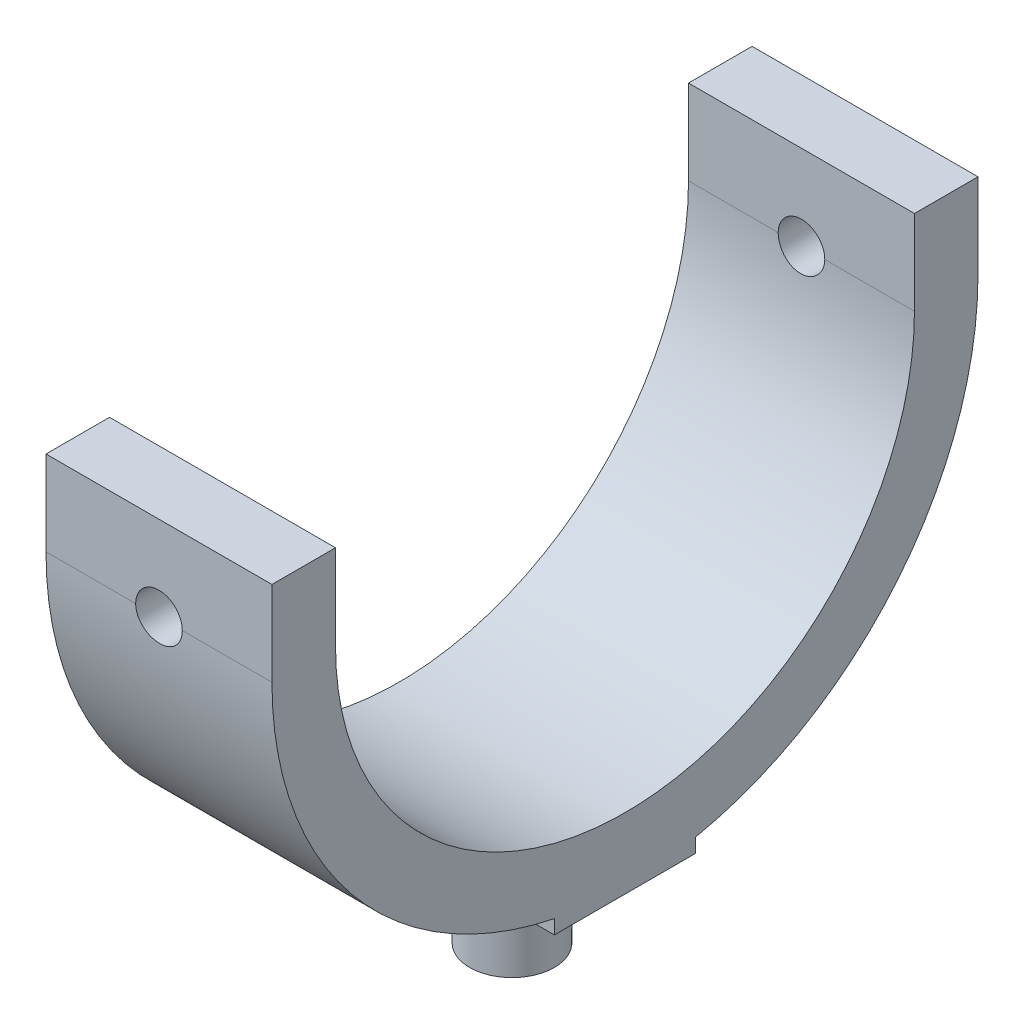
ISO-10303-21;
HEADER;
FILE_DESCRIPTION(('STEP AP214'),'2;1');
FILE_NAME('part.step','',(''),(''),'','','');
FILE_SCHEMA(('AUTOMOTIVE_DESIGN { 1 0 10303 214 1 1 1 1 }'));
ENDSEC;
DATA;
#1=APPLICATION_CONTEXT('core data for automotive mechanical design processes');
#2=APPLICATION_PROTOCOL_DEFINITION('international standard','automotive_design',2000,#1);
#3=PRODUCT_CONTEXT('',#1,'mechanical');
#4=PRODUCT('Part','Part','',(#3));
#5=PRODUCT_RELATED_PRODUCT_CATEGORY('part','',(#4));
#6=PRODUCT_DEFINITION_FORMATION('','',#4);
#7=PRODUCT_DEFINITION_CONTEXT('part definition',#1,'design');
#8=PRODUCT_DEFINITION('design','',#6,#7);
#9=PRODUCT_DEFINITION_SHAPE('','',#8);
#10=(LENGTH_UNIT() NAMED_UNIT(*) SI_UNIT(.MILLI.,.METRE.));
#11=(NAMED_UNIT(*) PLANE_ANGLE_UNIT() SI_UNIT($,.RADIAN.));
#12=(NAMED_UNIT(*) SI_UNIT($,.STERADIAN.) SOLID_ANGLE_UNIT());
#13=UNCERTAINTY_MEASURE_WITH_UNIT(LENGTH_MEASURE(1.E-05),#10,'distance_accuracy_value','');
#14=(GEOMETRIC_REPRESENTATION_CONTEXT(3) GLOBAL_UNCERTAINTY_ASSIGNED_CONTEXT((#13)) GLOBAL_UNIT_ASSIGNED_CONTEXT((#10,
#11,#12)) REPRESENTATION_CONTEXT('',''));
#15=CARTESIAN_POINT('',(0.,0.,0.));
#16=DIRECTION('',(0.,0.,1.));
#17=DIRECTION('',(1.,0.,0.));
#18=AXIS2_PLACEMENT_3D('',#15,#16,#17);
#19=CARTESIAN_POINT('',(16.,0.,0.));
#20=DIRECTION('',(-1.,0.,0.));
#21=DIRECTION('',(0.,0.,1.));
#22=AXIS2_PLACEMENT_3D('',#19,#20,#21);
#23=CYLINDRICAL_SURFACE('',#22,25.);
#24=DIRECTION('',(-1.,0.,0.));
#25=VECTOR('',#24,1.);
#26=CARTESIAN_POINT('',(16.,0.,25.));
#27=LINE('',#26,#25);
#28=CARTESIAN_POINT('',(16.,0.,25.));
#29=VERTEX_POINT('',#28);
#30=CARTESIAN_POINT('',(9.65,0.,25.));
#31=VERTEX_POINT('',#30);
#32=EDGE_CURVE('E172',#29,#31,#27,.T.);
#33=ORIENTED_EDGE('',*,*,#32,.T.);
#34=CARTESIAN_POINT('',(9.65,0.,25.));
#35=CARTESIAN_POINT('',(9.64999975171216,-0.0463675277179691,25.0000007216861));
#36=CARTESIAN_POINT('',(9.64804427485433,-0.0927127923924498,24.9998708391193));
#37=CARTESIAN_POINT('',(9.64024347418809,-0.185070719095155,24.9993575181398));
#38=CARTESIAN_POINT('',(9.63439836773969,-0.231083399563594,24.9989740938954));
#39=CARTESIAN_POINT('',(9.6110854039806,-0.368044265142285,24.9974566704274));
#40=CARTESIAN_POINT('',(9.58783974129145,-0.458073444341846,24.9959554699818));
#41=CARTESIAN_POINT('',(9.52659377759014,-0.632937036061563,24.9921400743889));
#42=CARTESIAN_POINT('',(9.48858718829978,-0.717769216761224,24.9898255327914));
#43=CARTESIAN_POINT('',(9.39890614737929,-0.879848459113714,24.9846441272748));
#44=CARTESIAN_POINT('',(9.3472339301069,-0.957096757917905,24.9817773536674));
#45=CARTESIAN_POINT('',(9.23160219968725,-1.10193316824845,24.9758086148959));
#46=CARTESIAN_POINT('',(9.16762591462477,-1.16950787163581,24.9727063322391));
#47=CARTESIAN_POINT('',(9.02922804336495,-1.29297719172721,24.9666185261965));
#48=CARTESIAN_POINT('',(8.95480486790854,-1.34887002807233,24.9636330206643));
#49=CARTESIAN_POINT('',(8.79755152583343,-1.44742163696724,24.9581132723375));
#50=CARTESIAN_POINT('',(8.71471403845083,-1.49006875208134,24.9555794278765));
#51=CARTESIAN_POINT('',(8.54304010275433,-1.56084168914115,24.9512532255126));
#52=CARTESIAN_POINT('',(8.45420409276552,-1.58896857081621,24.9494608134998));
#53=CARTESIAN_POINT('',(8.27318697002812,-1.62986697327793,24.9468225924599));
#54=CARTESIAN_POINT('',(8.18101090173132,-1.64266073104221,24.9459754127262));
#55=CARTESIAN_POINT('',(7.99581367114066,-1.65259845002786,24.945319087858));
#56=CARTESIAN_POINT('',(7.90279249853516,-1.64974222003717,24.9455099554064));
#57=CARTESIAN_POINT('',(7.71870239631539,-1.6284789296367,24.9469069644263));
#58=CARTESIAN_POINT('',(7.62763061849028,-1.61009640806335,24.9481115038089));
#59=CARTESIAN_POINT('',(7.44986859058131,-1.55834047638568,24.9513975891655));
#60=CARTESIAN_POINT('',(7.36317834920637,-1.52496703648617,24.9534791368825));
#61=CARTESIAN_POINT('',(7.19655935922978,-1.44414807367931,24.9582865647081));
#62=CARTESIAN_POINT('',(7.11663615834753,-1.39669114578092,24.9610129666634));
#63=CARTESIAN_POINT('',(6.96588484832023,-1.28906280984226,24.9668021838505));
#64=CARTESIAN_POINT('',(6.89505642628952,-1.2288918393889,24.9698649875024));
#65=CARTESIAN_POINT('',(6.76436761617399,-1.0974151516699,24.9759886518482));
#66=CARTESIAN_POINT('',(6.70452698166769,-1.02608979929733,24.9790494993723));
#67=CARTESIAN_POINT('',(6.59764712130048,-0.874366837560622,24.9848200922055));
#68=CARTESIAN_POINT('',(6.55061188714117,-0.793966410335377,24.9875297278971));
#69=CARTESIAN_POINT('',(6.47068161397872,-0.626353133244862,24.9922931249024));
#70=CARTESIAN_POINT('',(6.43779592086405,-0.539135825569342,24.9943464524898));
#71=CARTESIAN_POINT('',(6.38719020125781,-0.360467943516302,24.9975600241316));
#72=CARTESIAN_POINT('',(6.36944711544158,-0.269024030143116,24.9987216258437));
#73=CARTESIAN_POINT('',(6.35633539467075,-0.147465246752205,24.9995825994283));
#74=CARTESIAN_POINT('',(6.35395839706743,-0.117996493328218,24.999739038418));
#75=CARTESIAN_POINT('',(6.35079285974872,-0.0590225223508973,24.9999476034456));
#76=CARTESIAN_POINT('',(6.3500016853385,-0.0295174469066215,24.9999999025012));
#77=CARTESIAN_POINT('',(6.35,0.,25.));
#78=B_SPLINE_CURVE_WITH_KNOTS('',3,(#34,#35,#36,#37,#38,#39,#40,#41,#42,#43,#44,#45,#46,#47,#48,
#49,#50,#51,#52,#53,#54,#55,#56,#57,#58,#59,#60,#61,#62,#63,#64,#65,#66,#67,#68,#69,#70,#71,#72,
#73,#74,#75,#76,#77),.UNSPECIFIED.,.F.,.F.,(4,2,2,2,2,2,2,2,2,2,2,2,2,2,2,2,2,2,2,2,2,4),(0.,
0.139016986590286,0.278026205295712,0.555576182645014,0.833244528530751,1.11086750311877,
1.38887162814717,1.66691809116803,1.94520857138698,2.22347873827585,2.50134485153278,
2.77921435977444,3.05664552362214,3.33407723888048,3.61173423787887,3.88938168214422,
4.1675234889485,4.44575189915035,4.72416380044523,5.00215097273925,5.09081536252593,
5.17933232233053),.UNSPECIFIED.);
#79=CARTESIAN_POINT('',(6.35,0.,25.));
#80=VERTEX_POINT('',#79);
#81=EDGE_CURVE('E158',#31,#80,#78,.T.);
#82=ORIENTED_EDGE('',*,*,#81,.T.);
#83=CARTESIAN_POINT('',(0.,0.,25.));
#84=VERTEX_POINT('',#83);
#85=EDGE_CURVE('E169',#80,#84,#27,.T.);
#86=ORIENTED_EDGE('',*,*,#85,.T.);
#87=CARTESIAN_POINT('',(0.,0.,0.));
#88=DIRECTION('',(1.,0.,0.));
#89=DIRECTION('',(0.,0.,-1.));
#90=AXIS2_PLACEMENT_3D('',#87,#88,#89);
#91=CIRCLE('',#90,25.);
#92=CARTESIAN_POINT('',(0.,-24.4948974278318,5.));
#93=VERTEX_POINT('',#92);
#94=EDGE_CURVE('E243',#84,#93,#91,.T.);
#95=ORIENTED_EDGE('',*,*,#94,.T.);
#96=DIRECTION('',(-1.,0.,0.));
#97=VECTOR('',#96,1.);
#98=CARTESIAN_POINT('',(16.,-24.4948974278318,5.));
#99=LINE('',#98,#97);
#100=CARTESIAN_POINT('',(16.,-24.4948974278318,5.));
#101=VERTEX_POINT('',#100);
#102=EDGE_CURVE('E45',#101,#93,#99,.T.);
#103=ORIENTED_EDGE('',*,*,#102,.F.);
#104=CARTESIAN_POINT('',(16.,0.,0.));
#105=DIRECTION('',(1.,0.,0.));
#106=DIRECTION('',(0.,0.,-1.));
#107=AXIS2_PLACEMENT_3D('',#104,#105,#106);
#108=CIRCLE('',#107,25.);
#109=EDGE_CURVE('E286',#29,#101,#108,.T.);
#110=ORIENTED_EDGE('',*,*,#109,.F.);
#111=EDGE_LOOP('',(#33,#82,#86,#95,#103,#110));
#112=FACE_BOUND('',#111,.T.);
#113=ADVANCED_FACE('F41',(#112),#23,.T.);
#114=CARTESIAN_POINT('',(16.,-24.4948974278318,5.));
#115=DIRECTION('',(0.,0.,-1.));
#116=DIRECTION('',(0.,1.,0.));
#117=AXIS2_PLACEMENT_3D('',#114,#115,#116);
#118=PLANE('',#117);
#119=DIRECTION('',(0.,-1.,0.));
#120=VECTOR('',#119,1.);
#121=CARTESIAN_POINT('',(0.,-24.4948974278318,5.));
#122=LINE('',#121,#120);
#123=CARTESIAN_POINT('',(0.,-25.4948974278318,5.));
#124=VERTEX_POINT('',#123);
#125=EDGE_CURVE('E240',#93,#124,#122,.T.);
#126=ORIENTED_EDGE('',*,*,#125,.T.);
#127=DIRECTION('',(-1.,0.,0.));
#128=VECTOR('',#127,1.);
#129=CARTESIAN_POINT('',(16.,-25.4948974278318,5.));
#130=LINE('',#129,#128);
#131=CARTESIAN_POINT('',(16.,-25.4948974278318,5.));
#132=VERTEX_POINT('',#131);
#133=EDGE_CURVE('E228',#132,#124,#130,.T.);
#134=ORIENTED_EDGE('',*,*,#133,.F.);
#135=DIRECTION('',(0.,-1.,0.));
#136=VECTOR('',#135,1.);
#137=CARTESIAN_POINT('',(16.,-24.4948974278318,5.));
#138=LINE('',#137,#136);
#139=EDGE_CURVE('E241',#101,#132,#138,.T.);
#140=ORIENTED_EDGE('',*,*,#139,.F.);
#141=ORIENTED_EDGE('',*,*,#102,.T.);
#142=EDGE_LOOP('',(#126,#134,#140,#141));
#143=FACE_BOUND('',#142,.T.);
#144=ADVANCED_FACE('F239',(#143),#118,.F.);
#145=CARTESIAN_POINT('',(16.,-25.4948974278318,5.));
#146=DIRECTION('',(0.,1.,0.));
#147=DIRECTION('',(0.,0.,1.));
#148=AXIS2_PLACEMENT_3D('',#145,#146,#147);
#149=PLANE('',#148);
#150=CARTESIAN_POINT('',(8.,-25.4948974278318,0.));
#151=DIRECTION('',(0.,-1.,0.));
#152=DIRECTION('',(0.,0.,-1.));
#153=AXIS2_PLACEMENT_3D('',#150,#151,#152);
#154=CIRCLE('',#153,3.);
#155=CARTESIAN_POINT('',(8.,-25.4948974278318,-3.));
#156=VERTEX_POINT('',#155);
#157=EDGE_CURVE('E11',#156,#156,#154,.T.);
#158=ORIENTED_EDGE('',*,*,#157,.F.);
#159=EDGE_LOOP('',(#158));
#160=FACE_BOUND('',#159,.T.);
#161=DIRECTION('',(0.,0.,-1.));
#162=VECTOR('',#161,1.);
#163=CARTESIAN_POINT('',(0.,-25.4948974278318,5.));
#164=LINE('',#163,#162);
#165=CARTESIAN_POINT('',(0.,-25.4948974278318,-5.));
#166=VERTEX_POINT('',#165);
#167=EDGE_CURVE('E249',#124,#166,#164,.T.);
#168=ORIENTED_EDGE('',*,*,#167,.T.);
#169=DIRECTION('',(-1.,0.,0.));
#170=VECTOR('',#169,1.);
#171=CARTESIAN_POINT('',(16.,-25.4948974278318,-5.));
#172=LINE('',#171,#170);
#173=CARTESIAN_POINT('',(16.,-25.4948974278318,-5.));
#174=VERTEX_POINT('',#173);
#175=EDGE_CURVE('E225',#174,#166,#172,.T.);
#176=ORIENTED_EDGE('',*,*,#175,.F.);
#177=DIRECTION('',(0.,0.,-1.));
#178=VECTOR('',#177,1.);
#179=CARTESIAN_POINT('',(16.,-25.4948974278318,5.));
#180=LINE('',#179,#178);
#181=EDGE_CURVE('E291',#132,#174,#180,.T.);
#182=ORIENTED_EDGE('',*,*,#181,.F.);
#183=ORIENTED_EDGE('',*,*,#133,.T.);
#184=EDGE_LOOP('',(#168,#176,#182,#183));
#185=FACE_BOUND('',#184,.T.);
#186=ADVANCED_FACE('F363',(#160,#185),#149,.F.);
#187=CARTESIAN_POINT('',(16.,-24.4948974278318,-5.));
#188=DIRECTION('',(0.,0.,1.));
#189=DIRECTION('',(0.,-1.,0.));
#190=AXIS2_PLACEMENT_3D('',#187,#188,#189);
#191=PLANE('',#190);
#192=DIRECTION('',(0.,1.,0.));
#193=VECTOR('',#192,1.);
#194=CARTESIAN_POINT('',(0.,-24.4948974278318,-5.));
#195=LINE('',#194,#193);
#196=CARTESIAN_POINT('',(0.,-24.4948974278318,-5.));
#197=VERTEX_POINT('',#196);
#198=EDGE_CURVE('E257',#166,#197,#195,.T.);
#199=ORIENTED_EDGE('',*,*,#198,.T.);
#200=DIRECTION('',(-1.,0.,0.));
#201=VECTOR('',#200,1.);
#202=CARTESIAN_POINT('',(16.,-24.4948974278318,-5.));
#203=LINE('',#202,#201);
#204=CARTESIAN_POINT('',(16.,-24.4948974278318,-5.));
#205=VERTEX_POINT('',#204);
#206=EDGE_CURVE('E221',#205,#197,#203,.T.);
#207=ORIENTED_EDGE('',*,*,#206,.F.);
#208=DIRECTION('',(0.,1.,0.));
#209=VECTOR('',#208,1.);
#210=CARTESIAN_POINT('',(16.,-24.4948974278318,-5.));
#211=LINE('',#210,#209);
#212=EDGE_CURVE('E296',#174,#205,#211,.T.);
#213=ORIENTED_EDGE('',*,*,#212,.F.);
#214=ORIENTED_EDGE('',*,*,#175,.T.);
#215=EDGE_LOOP('',(#199,#207,#213,#214));
#216=FACE_BOUND('',#215,.T.);
#217=ADVANCED_FACE('F360',(#216),#191,.F.);
#218=CARTESIAN_POINT('',(16.,0.,0.));
#219=DIRECTION('',(-1.,0.,0.));
#220=DIRECTION('',(0.,0.,1.));
#221=AXIS2_PLACEMENT_3D('',#218,#219,#220);
#222=CYLINDRICAL_SURFACE('',#221,25.);
#223=DIRECTION('',(-1.,0.,0.));
#224=VECTOR('',#223,1.);
#225=CARTESIAN_POINT('',(16.,0.,-25.));
#226=LINE('',#225,#224);
#227=CARTESIAN_POINT('',(6.35,0.,-25.));
#228=VERTEX_POINT('',#227);
#229=CARTESIAN_POINT('',(0.,0.,-25.));
#230=VERTEX_POINT('',#229);
#231=EDGE_CURVE('E216',#228,#230,#226,.T.);
#232=ORIENTED_EDGE('',*,*,#231,.F.);
#233=CARTESIAN_POINT('',(6.35,0.,-25.));
#234=CARTESIAN_POINT('',(6.35000024828784,-0.0463675277179661,-25.0000007216861));
#235=CARTESIAN_POINT('',(6.35195572514568,-0.0927127923924468,-24.9998708391193));
#236=CARTESIAN_POINT('',(6.35975652581191,-0.185070719095152,-24.9993575181398));
#237=CARTESIAN_POINT('',(6.36560163226031,-0.231083399563591,-24.9989740938954));
#238=CARTESIAN_POINT('',(6.3889145960194,-0.368044265142283,-24.9974566704274));
#239=CARTESIAN_POINT('',(6.41216025870855,-0.458073444341844,-24.9959554699818));
#240=CARTESIAN_POINT('',(6.47340622240986,-0.63293703606156,-24.9921400743889));
#241=CARTESIAN_POINT('',(6.51141281170022,-0.717769216761222,-24.9898255327914));
#242=CARTESIAN_POINT('',(6.60109385262071,-0.879848459113711,-24.9846441272748));
#243=CARTESIAN_POINT('',(6.65276606989309,-0.957096757917903,-24.9817773536674));
#244=CARTESIAN_POINT('',(6.76839780031275,-1.10193316824845,-24.9758086148959));
#245=CARTESIAN_POINT('',(6.83237408537523,-1.16950787163581,-24.9727063322391));
#246=CARTESIAN_POINT('',(6.97077195663505,-1.29297719172721,-24.9666185261965));
#247=CARTESIAN_POINT('',(7.04519513209146,-1.34887002807232,-24.9636330206643));
#248=CARTESIAN_POINT('',(7.20244847416657,-1.44742163696724,-24.9581132723375));
#249=CARTESIAN_POINT('',(7.28528596154916,-1.49006875208134,-24.9555794278765));
#250=CARTESIAN_POINT('',(7.45695989724566,-1.56084168914115,-24.9512532255126));
#251=CARTESIAN_POINT('',(7.54579590723448,-1.58896857081621,-24.9494608134998));
#252=CARTESIAN_POINT('',(7.72681302997188,-1.62986697327793,-24.9468225924599));
#253=CARTESIAN_POINT('',(7.81898909826868,-1.64266073104221,-24.9459754127262));
#254=CARTESIAN_POINT('',(8.00418632885933,-1.65259845002786,-24.945319087858));
#255=CARTESIAN_POINT('',(8.09720750146484,-1.64974222003717,-24.9455099554064));
#256=CARTESIAN_POINT('',(8.2812976036846,-1.6284789296367,-24.9469069644263));
#257=CARTESIAN_POINT('',(8.37236938150972,-1.61009640806335,-24.9481115038089));
#258=CARTESIAN_POINT('',(8.55013140941868,-1.55834047638568,-24.9513975891655));
#259=CARTESIAN_POINT('',(8.63682165079363,-1.52496703648617,-24.9534791368825));
#260=CARTESIAN_POINT('',(8.80344064077022,-1.44414807367931,-24.9582865647081));
#261=CARTESIAN_POINT('',(8.88336384165247,-1.39669114578092,-24.9610129666634));
#262=CARTESIAN_POINT('',(9.03411515167977,-1.28906280984226,-24.9668021838505));
#263=CARTESIAN_POINT('',(9.10494357371048,-1.2288918393889,-24.9698649875024));
#264=CARTESIAN_POINT('',(9.23563238382601,-1.0974151516699,-24.9759886518482));
#265=CARTESIAN_POINT('',(9.29547301833231,-1.02608979929733,-24.9790494993723));
#266=CARTESIAN_POINT('',(9.40235287869952,-0.874366837560623,-24.9848200922055));
#267=CARTESIAN_POINT('',(9.44938811285883,-0.793966410335379,-24.9875297278971));
#268=CARTESIAN_POINT('',(9.52931838602128,-0.626353133244864,-24.9922931249024));
#269=CARTESIAN_POINT('',(9.56220407913595,-0.539135825569344,-24.9943464524898));
#270=CARTESIAN_POINT('',(9.61280979874219,-0.360467943516305,-24.9975600241316));
#271=CARTESIAN_POINT('',(9.63055288455842,-0.269024030143119,-24.9987216258437));
#272=CARTESIAN_POINT('',(9.64366460532925,-0.147465246752207,-24.9995825994283));
#273=CARTESIAN_POINT('',(9.64604160293257,-0.117996493328219,-24.999739038418));
#274=CARTESIAN_POINT('',(9.64920714025128,-0.0590225223508964,-24.9999476034456));
#275=CARTESIAN_POINT('',(9.6499983146615,-0.0295174469066194,-24.9999999025012));
#276=CARTESIAN_POINT('',(9.65,0.,-25.));
#277=B_SPLINE_CURVE_WITH_KNOTS('',3,(#233,#234,#235,#236,#237,#238,#239,#240,#241,#242,#243,
#244,#245,#246,#247,#248,#249,#250,#251,#252,#253,#254,#255,#256,#257,#258,#259,#260,#261,#262,
#263,#264,#265,#266,#267,#268,#269,#270,#271,#272,#273,#274,#275,#276),.UNSPECIFIED.,.F.,.F.,(4,
2,2,2,2,2,2,2,2,2,2,2,2,2,2,2,2,2,2,2,2,4),(0.,0.139016986590286,0.278026205295712,
0.555576182645014,0.833244528530752,1.11086750311877,1.38887162814717,1.66691809116803,
1.94520857138698,2.22347873827585,2.50134485153278,2.77921435977444,3.05664552362214,
3.33407723888049,3.61173423787887,3.88938168214422,4.1675234889485,4.44575189915035,
4.72416380044523,5.00215097273925,5.09081536252594,5.17933232233054),.UNSPECIFIED.);
#278=CARTESIAN_POINT('',(9.65,0.,-25.));
#279=VERTEX_POINT('',#278);
#280=EDGE_CURVE('E57',#228,#279,#277,.T.);
#281=ORIENTED_EDGE('',*,*,#280,.T.);
#282=CARTESIAN_POINT('',(16.,0.,-25.));
#283=VERTEX_POINT('',#282);
#284=EDGE_CURVE('E217',#283,#279,#226,.T.);
#285=ORIENTED_EDGE('',*,*,#284,.F.);
#286=CARTESIAN_POINT('',(16.,0.,0.));
#287=DIRECTION('',(1.,0.,0.));
#288=DIRECTION('',(0.,0.,-1.));
#289=AXIS2_PLACEMENT_3D('',#286,#287,#288);
#290=CIRCLE('',#289,25.);
#291=EDGE_CURVE('E299',#205,#283,#290,.T.);
#292=ORIENTED_EDGE('',*,*,#291,.F.);
#293=ORIENTED_EDGE('',*,*,#206,.T.);
#294=CARTESIAN_POINT('',(0.,0.,0.));
#295=DIRECTION('',(1.,0.,0.));
#296=DIRECTION('',(0.,0.,-1.));
#297=AXIS2_PLACEMENT_3D('',#294,#295,#296);
#298=CIRCLE('',#297,25.);
#299=EDGE_CURVE('E260',#197,#230,#298,.T.);
#300=ORIENTED_EDGE('',*,*,#299,.T.);
#301=EDGE_LOOP('',(#232,#281,#285,#292,#293,#300));
#302=FACE_BOUND('',#301,.T.);
#303=ADVANCED_FACE('F355',(#302),#222,.T.);
#304=CARTESIAN_POINT('',(16.,0.,-25.));
#305=DIRECTION('',(0.,0.,1.));
#306=DIRECTION('',(1.,0.,0.));
#307=AXIS2_PLACEMENT_3D('',#304,#305,#306);
#308=PLANE('',#307);
#309=ORIENTED_EDGE('',*,*,#284,.T.);
#310=CARTESIAN_POINT('',(8.,0.,-25.));
#311=DIRECTION('',(0.,0.,-1.));
#312=DIRECTION('',(-1.,0.,0.));
#313=AXIS2_PLACEMENT_3D('',#310,#311,#312);
#314=CIRCLE('',#313,1.65);
#315=EDGE_CURVE('E165',#228,#279,#314,.T.);
#316=ORIENTED_EDGE('',*,*,#315,.F.);
#317=ORIENTED_EDGE('',*,*,#231,.T.);
#318=DIRECTION('',(0.,1.,0.));
#319=VECTOR('',#318,1.);
#320=CARTESIAN_POINT('',(0.,0.,-25.));
#321=LINE('',#320,#319);
#322=CARTESIAN_POINT('',(0.,6.,-25.));
#323=VERTEX_POINT('',#322);
#324=EDGE_CURVE('E264',#230,#323,#321,.T.);
#325=ORIENTED_EDGE('',*,*,#324,.T.);
#326=DIRECTION('',(-1.,0.,0.));
#327=VECTOR('',#326,1.);
#328=CARTESIAN_POINT('',(16.,6.,-25.));
#329=LINE('',#328,#327);
#330=CARTESIAN_POINT('',(16.,6.,-25.));
#331=VERTEX_POINT('',#330);
#332=EDGE_CURVE('E212',#331,#323,#329,.T.);
#333=ORIENTED_EDGE('',*,*,#332,.F.);
#334=DIRECTION('',(0.,1.,0.));
#335=VECTOR('',#334,1.);
#336=CARTESIAN_POINT('',(16.,0.,-25.));
#337=LINE('',#336,#335);
#338=EDGE_CURVE('E302',#283,#331,#337,.T.);
#339=ORIENTED_EDGE('',*,*,#338,.F.);
#340=EDGE_LOOP('',(#309,#316,#317,#325,#333,#339));
#341=FACE_BOUND('',#340,.T.);
#342=ADVANCED_FACE('F351',(#341),#308,.F.);
#343=CARTESIAN_POINT('',(16.,6.,-25.));
#344=DIRECTION('',(0.,-1.,0.));
#345=DIRECTION('',(0.,0.,-1.));
#346=AXIS2_PLACEMENT_3D('',#343,#344,#345);
#347=PLANE('',#346);
#348=DIRECTION('',(0.,0.,1.));
#349=VECTOR('',#348,1.);
#350=CARTESIAN_POINT('',(0.,6.,-25.));
#351=LINE('',#350,#349);
#352=CARTESIAN_POINT('',(0.,6.,-20.5));
#353=VERTEX_POINT('',#352);
#354=EDGE_CURVE('E267',#323,#353,#351,.T.);
#355=ORIENTED_EDGE('',*,*,#354,.T.);
#356=DIRECTION('',(-1.,0.,0.));
#357=VECTOR('',#356,1.);
#358=CARTESIAN_POINT('',(16.,6.,-20.5));
#359=LINE('',#358,#357);
#360=CARTESIAN_POINT('',(16.,6.,-20.5));
#361=VERTEX_POINT('',#360);
#362=EDGE_CURVE('E208',#361,#353,#359,.T.);
#363=ORIENTED_EDGE('',*,*,#362,.F.);
#364=DIRECTION('',(0.,0.,1.));
#365=VECTOR('',#364,1.);
#366=CARTESIAN_POINT('',(16.,6.,-25.));
#367=LINE('',#366,#365);
#368=EDGE_CURVE('E305',#331,#361,#367,.T.);
#369=ORIENTED_EDGE('',*,*,#368,.F.);
#370=ORIENTED_EDGE('',*,*,#332,.T.);
#371=EDGE_LOOP('',(#355,#363,#369,#370));
#372=FACE_BOUND('',#371,.T.);
#373=ADVANCED_FACE('F346',(#372),#347,.F.);
#374=CARTESIAN_POINT('',(16.,0.,-20.5));
#375=DIRECTION('',(0.,0.,-1.));
#376=DIRECTION('',(-1.,0.,0.));
#377=AXIS2_PLACEMENT_3D('',#374,#375,#376);
#378=PLANE('',#377);
#379=DIRECTION('',(-1.,0.,0.));
#380=VECTOR('',#379,1.);
#381=CARTESIAN_POINT('',(16.,0.,-20.5));
#382=LINE('',#381,#380);
#383=CARTESIAN_POINT('',(6.35,0.,-20.5));
#384=VERTEX_POINT('',#383);
#385=CARTESIAN_POINT('',(0.,0.,-20.5));
#386=VERTEX_POINT('',#385);
#387=EDGE_CURVE('E203',#384,#386,#382,.T.);
#388=ORIENTED_EDGE('',*,*,#387,.F.);
#389=CARTESIAN_POINT('',(8.,0.,-20.5));
#390=DIRECTION('',(0.,0.,-1.));
#391=DIRECTION('',(-1.,0.,0.));
#392=AXIS2_PLACEMENT_3D('',#389,#390,#391);
#393=CIRCLE('',#392,1.65);
#394=CARTESIAN_POINT('',(9.65,0.,-20.5));
#395=VERTEX_POINT('',#394);
#396=EDGE_CURVE('E64',#384,#395,#393,.T.);
#397=ORIENTED_EDGE('',*,*,#396,.T.);
#398=CARTESIAN_POINT('',(16.,0.,-20.5));
#399=VERTEX_POINT('',#398);
#400=EDGE_CURVE('E204',#399,#395,#382,.T.);
#401=ORIENTED_EDGE('',*,*,#400,.F.);
#402=DIRECTION('',(0.,-1.,0.));
#403=VECTOR('',#402,1.);
#404=CARTESIAN_POINT('',(16.,0.,-20.5));
#405=LINE('',#404,#403);
#406=EDGE_CURVE('E308',#361,#399,#405,.T.);
#407=ORIENTED_EDGE('',*,*,#406,.F.);
#408=ORIENTED_EDGE('',*,*,#362,.T.);
#409=DIRECTION('',(0.,-1.,0.));
#410=VECTOR('',#409,1.);
#411=CARTESIAN_POINT('',(0.,0.,-20.5));
#412=LINE('',#411,#410);
#413=EDGE_CURVE('E270',#353,#386,#412,.T.);
#414=ORIENTED_EDGE('',*,*,#413,.T.);
#415=EDGE_LOOP('',(#388,#397,#401,#407,#408,#414));
#416=FACE_BOUND('',#415,.T.);
#417=ADVANCED_FACE('F339',(#416),#378,.F.);
#418=CARTESIAN_POINT('',(16.,0.,0.));
#419=DIRECTION('',(-1.,0.,0.));
#420=DIRECTION('',(0.,0.,1.));
#421=AXIS2_PLACEMENT_3D('',#418,#419,#420);
#422=CYLINDRICAL_SURFACE('',#421,20.5);
#423=DIRECTION('',(-1.,0.,0.));
#424=VECTOR('',#423,1.);
#425=CARTESIAN_POINT('',(16.,0.,20.5));
#426=LINE('',#425,#424);
#427=CARTESIAN_POINT('',(6.35,0.,20.5));
#428=VERTEX_POINT('',#427);
#429=CARTESIAN_POINT('',(0.,0.,20.5));
#430=VERTEX_POINT('',#429);
#431=EDGE_CURVE('E198',#428,#430,#426,.T.);
#432=ORIENTED_EDGE('',*,*,#431,.F.);
#433=CARTESIAN_POINT('',(6.35,0.,20.5));
#434=CARTESIAN_POINT('',(6.35000021930985,-0.0463414756947314,20.5000008785345));
#435=CARTESIAN_POINT('',(6.35195352884282,-0.0926606773830773,20.4998426639701));
#436=CARTESIAN_POINT('',(6.35974549295238,-0.184966188177176,20.4992173657934));
#437=CARTESIAN_POINT('',(6.36558391538881,-0.230952517006534,20.4987503006353));
#438=CARTESIAN_POINT('',(6.38886910246245,-0.367830210880542,20.4969019056795));
#439=CARTESIAN_POINT('',(6.41208595386348,-0.457802379738745,20.4950733133301));
#440=CARTESIAN_POINT('',(6.47325100297946,-0.632552672048779,20.4904256574223));
#441=CARTESIAN_POINT('',(6.51120521104804,-0.71732865998202,20.4876061897986));
#442=CARTESIAN_POINT('',(6.60075830480613,-0.879306949003956,20.4812936584388));
#443=CARTESIAN_POINT('',(6.65235517701786,-0.956510365401367,20.4778006941226));
#444=CARTESIAN_POINT('',(6.76785487290258,-1.10132438403392,20.4705242559206));
#445=CARTESIAN_POINT('',(6.83178242966589,-1.16891522366998,20.4667402075024));
#446=CARTESIAN_POINT('',(6.97008538445485,-1.29242889965556,20.4593124376053));
#447=CARTESIAN_POINT('',(7.04446237351133,-1.34834995593499,20.4556687376037));
#448=CARTESIAN_POINT('',(7.20166940008532,-1.44699371873488,20.4489282384152));
#449=CARTESIAN_POINT('',(7.28451057472148,-1.48969873028299,20.4458321748136));
#450=CARTESIAN_POINT('',(7.45621146212344,-1.56058306188185,20.4405442970906));
#451=CARTESIAN_POINT('',(7.54507070822288,-1.58876350677225,20.4383524129487));
#452=CARTESIAN_POINT('',(7.72608589881434,-1.62974349943341,20.4351256949075));
#453=CARTESIAN_POINT('',(7.81823428687245,-1.64257622544586,20.4340883654647));
#454=CARTESIAN_POINT('',(8.003384783232,-1.6525990724476,20.4332802771489));
#455=CARTESIAN_POINT('',(8.09638689745574,-1.64978908484112,20.433509527069));
#456=CARTESIAN_POINT('',(8.28037255399479,-1.62863315181372,20.4352064749257));
#457=CARTESIAN_POINT('',(8.37136032292347,-1.61032369772679,20.4366712639287));
#458=CARTESIAN_POINT('',(8.54896658060047,-1.55874531235362,20.4406696674489));
#459=CARTESIAN_POINT('',(8.63558504985961,-1.52547631434718,20.4432032867332));
#460=CARTESIAN_POINT('',(8.80211247046871,-1.44488155174302,20.4490572784443));
#461=CARTESIAN_POINT('',(8.8820133115434,-1.39753910005872,20.4523785838908));
#462=CARTESIAN_POINT('',(9.03274455526308,-1.29015550898992,20.459432641011));
#463=CARTESIAN_POINT('',(9.10357520473623,-1.23011471528479,20.4631653814831));
#464=CARTESIAN_POINT('',(9.23436248852468,-1.09884372337974,20.4706342536804));
#465=CARTESIAN_POINT('',(9.2942890480381,-1.02758355982374,20.4743703670533));
#466=CARTESIAN_POINT('',(9.40135215913003,-0.875970611058452,20.4814165440947));
#467=CARTESIAN_POINT('',(9.44848476182873,-0.79561502934989,20.4847264760562));
#468=CARTESIAN_POINT('',(9.52861823694727,-0.628062514119988,20.490548291242));
#469=CARTESIAN_POINT('',(9.5616092702336,-0.540860867130781,20.4930596185167));
#470=CARTESIAN_POINT('',(9.6124237665534,-0.362197462974377,20.4969938793913));
#471=CARTESIAN_POINT('',(9.63027024232207,-0.270742392932519,20.4984184640042));
#472=CARTESIAN_POINT('',(9.64354204653517,-0.148882096139438,20.4994811389035));
#473=CARTESIAN_POINT('',(9.64596501089001,-0.119131259709927,20.4996756003121));
#474=CARTESIAN_POINT('',(9.64919179121781,-0.0595910418986726,20.4999348655871));
#475=CARTESIAN_POINT('',(9.6499982995747,-0.0298018074453572,20.4999998850519));
#476=CARTESIAN_POINT('',(9.65,0.,20.5));
#477=B_SPLINE_CURVE_WITH_KNOTS('',3,(#433,#434,#435,#436,#437,#438,#439,#440,#441,#442,#443,
#444,#445,#446,#447,#448,#449,#450,#451,#452,#453,#454,#455,#456,#457,#458,#459,#460,#461,#462,
#463,#464,#465,#466,#467,#468,#469,#470,#471,#472,#473,#474,#475,#476),.UNSPECIFIED.,.F.,.F.,(4,
2,2,2,2,2,2,2,2,2,2,2,2,2,2,2,2,2,2,2,2,4),(0.,0.138938802847583,0.277869304680234,
0.555250224009541,0.832744386946178,1.11019761823235,1.38821326841754,1.66627129524115,
1.94470001938355,2.22310717766806,2.50091138945477,2.77871752983275,3.05587142760817,
3.33302656151395,3.61051164182093,3.88798916928915,4.16622078124864,4.44453817254366,
4.72304889277561,5.00113564359981,5.09065417766738,5.18002348452029),.UNSPECIFIED.);
#478=CARTESIAN_POINT('',(9.65,0.,20.5));
#479=VERTEX_POINT('',#478);
#480=EDGE_CURVE('E393',#428,#479,#477,.T.);
#481=ORIENTED_EDGE('',*,*,#480,.T.);
#482=CARTESIAN_POINT('',(16.,0.,20.5));
#483=VERTEX_POINT('',#482);
#484=EDGE_CURVE('E199',#483,#479,#426,.T.);
#485=ORIENTED_EDGE('',*,*,#484,.F.);
#486=CARTESIAN_POINT('',(16.,0.,0.));
#487=DIRECTION('',(-1.,0.,0.));
#488=DIRECTION('',(0.,0.,-1.));
#489=AXIS2_PLACEMENT_3D('',#486,#487,#488);
#490=CIRCLE('',#489,20.5);
#491=EDGE_CURVE('E311',#399,#483,#490,.T.);
#492=ORIENTED_EDGE('',*,*,#491,.F.);
#493=ORIENTED_EDGE('',*,*,#400,.T.);
#494=CARTESIAN_POINT('',(9.65,0.,-20.5));
#495=CARTESIAN_POINT('',(9.64999978069015,-0.0463414756947289,-20.5000008785345));
#496=CARTESIAN_POINT('',(9.64804647115718,-0.0926606773830747,-20.4998426639701));
#497=CARTESIAN_POINT('',(9.64025450704762,-0.184966188177173,-20.4992173657934));
#498=CARTESIAN_POINT('',(9.63441608461119,-0.230952517006531,-20.4987503006353));
#499=CARTESIAN_POINT('',(9.61113089753755,-0.36783021088054,-20.4969019056795));
#500=CARTESIAN_POINT('',(9.58791404613652,-0.457802379738743,-20.4950733133301));
#501=CARTESIAN_POINT('',(9.52674899702054,-0.632552672048776,-20.4904256574223));
#502=CARTESIAN_POINT('',(9.48879478895196,-0.717328659982017,-20.4876061897986));
#503=CARTESIAN_POINT('',(9.39924169519388,-0.879306949003954,-20.4812936584388));
#504=CARTESIAN_POINT('',(9.34764482298215,-0.956510365401366,-20.4778006941226));
#505=CARTESIAN_POINT('',(9.23214512709743,-1.10132438403392,-20.4705242559206));
#506=CARTESIAN_POINT('',(9.16821757033412,-1.16891522366997,-20.4667402075024));
#507=CARTESIAN_POINT('',(9.02991461554515,-1.29242889965555,-20.4593124376053));
#508=CARTESIAN_POINT('',(8.95553762648868,-1.34834995593499,-20.4556687376037));
#509=CARTESIAN_POINT('',(8.79833059991468,-1.44699371873488,-20.4489282384152));
#510=CARTESIAN_POINT('',(8.71548942527852,-1.48969873028299,-20.4458321748136));
#511=CARTESIAN_POINT('',(8.54378853787656,-1.56058306188185,-20.4405442970906));
#512=CARTESIAN_POINT('',(8.45492929177712,-1.58876350677225,-20.4383524129487));
#513=CARTESIAN_POINT('',(8.27391410118567,-1.62974349943341,-20.4351256949075));
#514=CARTESIAN_POINT('',(8.18176571312755,-1.64257622544586,-20.4340883654647));
#515=CARTESIAN_POINT('',(7.996615216768,-1.6525990724476,-20.4332802771489));
#516=CARTESIAN_POINT('',(7.90361310254426,-1.64978908484112,-20.433509527069));
#517=CARTESIAN_POINT('',(7.71962744600521,-1.62863315181372,-20.4352064749256));
#518=CARTESIAN_POINT('',(7.62863967707654,-1.61032369772679,-20.4366712639287));
#519=CARTESIAN_POINT('',(7.45103341939954,-1.55874531235362,-20.4406696674489));
#520=CARTESIAN_POINT('',(7.36441495014039,-1.52547631434718,-20.4432032867332));
#521=CARTESIAN_POINT('',(7.19788752953129,-1.44488155174302,-20.4490572784443));
#522=CARTESIAN_POINT('',(7.1179866884566,-1.39753910005873,-20.4523785838908));
#523=CARTESIAN_POINT('',(6.96725544473692,-1.29015550898992,-20.459432641011));
#524=CARTESIAN_POINT('',(6.89642479526377,-1.2301147152848,-20.4631653814831));
#525=CARTESIAN_POINT('',(6.76563751147532,-1.09884372337974,-20.4706342536804));
#526=CARTESIAN_POINT('',(6.7057109519619,-1.02758355982374,-20.4743703670533));
#527=CARTESIAN_POINT('',(6.59864784086997,-0.875970611058453,-20.4814165440947));
#528=CARTESIAN_POINT('',(6.55151523817127,-0.795615029349892,-20.4847264760562));
#529=CARTESIAN_POINT('',(6.47138176305273,-0.628062514119991,-20.490548291242));
#530=CARTESIAN_POINT('',(6.4383907297664,-0.540860867130783,-20.4930596185167));
#531=CARTESIAN_POINT('',(6.3875762334466,-0.362197462974379,-20.4969938793913));
#532=CARTESIAN_POINT('',(6.36972975767793,-0.270742392932521,-20.4984184640042));
#533=CARTESIAN_POINT('',(6.35645795346483,-0.14888209613944,-20.4994811389035));
#534=CARTESIAN_POINT('',(6.35403498910999,-0.119131259709928,-20.4996756003121));
#535=CARTESIAN_POINT('',(6.35080820878219,-0.0595910418986723,-20.4999348655871));
#536=CARTESIAN_POINT('',(6.3500017004253,-0.0298018074453558,-20.4999998850519));
#537=CARTESIAN_POINT('',(6.35,0.,-20.5));
#538=B_SPLINE_CURVE_WITH_KNOTS('',3,(#494,#495,#496,#497,#498,#499,#500,#501,#502,#503,#504,
#505,#506,#507,#508,#509,#510,#511,#512,#513,#514,#515,#516,#517,#518,#519,#520,#521,#522,#523,
#524,#525,#526,#527,#528,#529,#530,#531,#532,#533,#534,#535,#536,#537),.UNSPECIFIED.,.F.,.F.,(4,
2,2,2,2,2,2,2,2,2,2,2,2,2,2,2,2,2,2,2,2,4),(0.,0.138938802847583,0.277869304680234,
0.555250224009541,0.832744386946178,1.11019761823234,1.38821326841754,1.66627129524115,
1.94470001938355,2.22310717766806,2.50091138945478,2.77871752983275,3.05587142760817,
3.33302656151395,3.61051164182093,3.88798916928915,4.16622078124864,4.44453817254366,
4.72304889277561,5.00113564359981,5.09065417766738,5.1800234845203),.UNSPECIFIED.);
#539=EDGE_CURVE('E336',#395,#384,#538,.T.);
#540=ORIENTED_EDGE('',*,*,#539,.T.);
#541=ORIENTED_EDGE('',*,*,#387,.T.);
#542=CARTESIAN_POINT('',(0.,0.,0.));
#543=DIRECTION('',(-1.,0.,0.));
#544=DIRECTION('',(0.,0.,-1.));
#545=AXIS2_PLACEMENT_3D('',#542,#543,#544);
#546=CIRCLE('',#545,20.5);
#547=EDGE_CURVE('E274',#386,#430,#546,.T.);
#548=ORIENTED_EDGE('',*,*,#547,.T.);
#549=EDGE_LOOP('',(#432,#481,#485,#492,#493,#540,#541,#548));
#550=FACE_BOUND('',#549,.T.);
#551=ADVANCED_FACE('F334',(#550),#422,.F.);
#552=CARTESIAN_POINT('',(16.,0.,20.5));
#553=DIRECTION('',(0.,0.,1.));
#554=DIRECTION('',(1.,0.,0.));
#555=AXIS2_PLACEMENT_3D('',#552,#553,#554);
#556=PLANE('',#555);
#557=ORIENTED_EDGE('',*,*,#484,.T.);
#558=CARTESIAN_POINT('',(8.,0.,20.5));
#559=DIRECTION('',(0.,0.,1.));
#560=DIRECTION('',(1.,0.,0.));
#561=AXIS2_PLACEMENT_3D('',#558,#559,#560);
#562=CIRCLE('',#561,1.65);
#563=EDGE_CURVE('E164',#479,#428,#562,.T.);
#564=ORIENTED_EDGE('',*,*,#563,.T.);
#565=ORIENTED_EDGE('',*,*,#431,.T.);
#566=DIRECTION('',(0.,1.,0.));
#567=VECTOR('',#566,1.);
#568=CARTESIAN_POINT('',(0.,0.,20.5));
#569=LINE('',#568,#567);
#570=CARTESIAN_POINT('',(0.,6.,20.5));
#571=VERTEX_POINT('',#570);
#572=EDGE_CURVE('E278',#430,#571,#569,.T.);
#573=ORIENTED_EDGE('',*,*,#572,.T.);
#574=DIRECTION('',(-1.,0.,0.));
#575=VECTOR('',#574,1.);
#576=CARTESIAN_POINT('',(16.,6.,20.5));
#577=LINE('',#576,#575);
#578=CARTESIAN_POINT('',(16.,6.,20.5));
#579=VERTEX_POINT('',#578);
#580=EDGE_CURVE('E194',#579,#571,#577,.T.);
#581=ORIENTED_EDGE('',*,*,#580,.F.);
#582=DIRECTION('',(0.,1.,0.));
#583=VECTOR('',#582,1.);
#584=CARTESIAN_POINT('',(16.,0.,20.5));
#585=LINE('',#584,#583);
#586=EDGE_CURVE('E314',#483,#579,#585,.T.);
#587=ORIENTED_EDGE('',*,*,#586,.F.);
#588=EDGE_LOOP('',(#557,#564,#565,#573,#581,#587));
#589=FACE_BOUND('',#588,.T.);
#590=ADVANCED_FACE('F328',(#589),#556,.F.);
#591=CARTESIAN_POINT('',(16.,6.,20.5));
#592=DIRECTION('',(0.,-1.,0.));
#593=DIRECTION('',(0.,0.,-1.));
#594=AXIS2_PLACEMENT_3D('',#591,#592,#593);
#595=PLANE('',#594);
#596=DIRECTION('',(0.,0.,1.));
#597=VECTOR('',#596,1.);
#598=CARTESIAN_POINT('',(0.,6.,20.5));
#599=LINE('',#598,#597);
#600=CARTESIAN_POINT('',(0.,6.,25.));
#601=VERTEX_POINT('',#600);
#602=EDGE_CURVE('E280',#571,#601,#599,.T.);
#603=ORIENTED_EDGE('',*,*,#602,.T.);
#604=DIRECTION('',(-1.,0.,0.));
#605=VECTOR('',#604,1.);
#606=CARTESIAN_POINT('',(16.,6.,25.));
#607=LINE('',#606,#605);
#608=CARTESIAN_POINT('',(16.,6.,25.));
#609=VERTEX_POINT('',#608);
#610=EDGE_CURVE('E186',#609,#601,#607,.T.);
#611=ORIENTED_EDGE('',*,*,#610,.F.);
#612=DIRECTION('',(0.,0.,1.));
#613=VECTOR('',#612,1.);
#614=CARTESIAN_POINT('',(16.,6.,20.5));
#615=LINE('',#614,#613);
#616=EDGE_CURVE('E187',#579,#609,#615,.T.);
#617=ORIENTED_EDGE('',*,*,#616,.F.);
#618=ORIENTED_EDGE('',*,*,#580,.T.);
#619=EDGE_LOOP('',(#603,#611,#617,#618));
#620=FACE_BOUND('',#619,.T.);
#621=ADVANCED_FACE('F322',(#620),#595,.F.);
#622=CARTESIAN_POINT('',(16.,0.,25.));
#623=DIRECTION('',(0.,0.,-1.));
#624=DIRECTION('',(-1.,0.,0.));
#625=AXIS2_PLACEMENT_3D('',#622,#623,#624);
#626=PLANE('',#625);
#627=ORIENTED_EDGE('',*,*,#85,.F.);
#628=CARTESIAN_POINT('',(8.,0.,25.));
#629=DIRECTION('',(0.,0.,-1.));
#630=DIRECTION('',(-1.,0.,0.));
#631=AXIS2_PLACEMENT_3D('',#628,#629,#630);
#632=CIRCLE('',#631,1.65);
#633=EDGE_CURVE('E155',#80,#31,#632,.T.);
#634=ORIENTED_EDGE('',*,*,#633,.T.);
#635=ORIENTED_EDGE('',*,*,#32,.F.);
#636=DIRECTION('',(0.,-1.,0.));
#637=VECTOR('',#636,1.);
#638=CARTESIAN_POINT('',(16.,0.,25.));
#639=LINE('',#638,#637);
#640=EDGE_CURVE('E182',#609,#29,#639,.T.);
#641=ORIENTED_EDGE('',*,*,#640,.F.);
#642=ORIENTED_EDGE('',*,*,#610,.T.);
#643=DIRECTION('',(0.,-1.,0.));
#644=VECTOR('',#643,1.);
#645=CARTESIAN_POINT('',(0.,0.,25.));
#646=LINE('',#645,#644);
#647=EDGE_CURVE('E179',#601,#84,#646,.T.);
#648=ORIENTED_EDGE('',*,*,#647,.T.);
#649=EDGE_LOOP('',(#627,#634,#635,#641,#642,#648));
#650=FACE_BOUND('',#649,.T.);
#651=ADVANCED_FACE('F176',(#650),#626,.F.);
#652=CARTESIAN_POINT('',(16.,0.,0.));
#653=DIRECTION('',(1.,0.,0.));
#654=DIRECTION('',(0.,0.,-1.));
#655=AXIS2_PLACEMENT_3D('',#652,#653,#654);
#656=PLANE('',#655);
#657=ORIENTED_EDGE('',*,*,#109,.T.);
#658=ORIENTED_EDGE('',*,*,#139,.T.);
#659=ORIENTED_EDGE('',*,*,#181,.T.);
#660=ORIENTED_EDGE('',*,*,#212,.T.);
#661=ORIENTED_EDGE('',*,*,#291,.T.);
#662=ORIENTED_EDGE('',*,*,#338,.T.);
#663=ORIENTED_EDGE('',*,*,#368,.T.);
#664=ORIENTED_EDGE('',*,*,#406,.T.);
#665=ORIENTED_EDGE('',*,*,#491,.T.);
#666=ORIENTED_EDGE('',*,*,#586,.T.);
#667=ORIENTED_EDGE('',*,*,#616,.T.);
#668=ORIENTED_EDGE('',*,*,#640,.T.);
#669=EDGE_LOOP('',(#657,#658,#659,#660,#661,#662,#663,#664,#665,#666,#667,#668));
#670=FACE_BOUND('',#669,.T.);
#671=ADVANCED_FACE('F318',(#670),#656,.T.);
#672=CARTESIAN_POINT('',(0.,0.,0.));
#673=DIRECTION('',(1.,0.,0.));
#674=DIRECTION('',(0.,0.,-1.));
#675=AXIS2_PLACEMENT_3D('',#672,#673,#674);
#676=PLANE('',#675);
#677=ORIENTED_EDGE('',*,*,#94,.F.);
#678=ORIENTED_EDGE('',*,*,#647,.F.);
#679=ORIENTED_EDGE('',*,*,#602,.F.);
#680=ORIENTED_EDGE('',*,*,#572,.F.);
#681=ORIENTED_EDGE('',*,*,#547,.F.);
#682=ORIENTED_EDGE('',*,*,#413,.F.);
#683=ORIENTED_EDGE('',*,*,#354,.F.);
#684=ORIENTED_EDGE('',*,*,#324,.F.);
#685=ORIENTED_EDGE('',*,*,#299,.F.);
#686=ORIENTED_EDGE('',*,*,#198,.F.);
#687=ORIENTED_EDGE('',*,*,#167,.F.);
#688=ORIENTED_EDGE('',*,*,#125,.F.);
#689=EDGE_LOOP('',(#677,#678,#679,#680,#681,#682,#683,#684,#685,#686,#687,#688));
#690=FACE_BOUND('',#689,.T.);
#691=ADVANCED_FACE('F323',(#690),#676,.F.);
#692=CARTESIAN_POINT('',(8.,-32.4948974278318,0.));
#693=DIRECTION('',(0.,1.,0.));
#694=DIRECTION('',(0.,0.,1.));
#695=AXIS2_PLACEMENT_3D('',#692,#693,#694);
#696=CYLINDRICAL_SURFACE('',#695,3.);
#697=CARTESIAN_POINT('',(8.,-32.4948974278318,0.));
#698=DIRECTION('',(0.,-1.,0.));
#699=DIRECTION('',(0.,0.,-1.));
#700=AXIS2_PLACEMENT_3D('',#697,#698,#699);
#701=CIRCLE('',#700,3.);
#702=CARTESIAN_POINT('',(8.,-32.4948974278318,-3.));
#703=VERTEX_POINT('',#702);
#704=EDGE_CURVE('E174',#703,#703,#701,.T.);
#705=ORIENTED_EDGE('',*,*,#704,.F.);
#706=EDGE_LOOP('',(#705));
#707=FACE_BOUND('',#706,.T.);
#708=ORIENTED_EDGE('',*,*,#157,.T.);
#709=EDGE_LOOP('',(#708));
#710=FACE_BOUND('',#709,.T.);
#711=ADVANCED_FACE('F505',(#707,#710),#696,.T.);
#712=CARTESIAN_POINT('',(8.,-32.4948974278318,0.));
#713=DIRECTION('',(0.,-1.,0.));
#714=DIRECTION('',(0.,0.,-1.));
#715=AXIS2_PLACEMENT_3D('',#712,#713,#714);
#716=PLANE('',#715);
#717=ORIENTED_EDGE('',*,*,#704,.T.);
#718=EDGE_LOOP('',(#717));
#719=FACE_BOUND('',#718,.T.);
#720=ADVANCED_FACE('F387',(#719),#716,.T.);
#721=CARTESIAN_POINT('',(8.,0.,25.));
#722=DIRECTION('',(0.,0.,-1.));
#723=DIRECTION('',(-1.,0.,0.));
#724=AXIS2_PLACEMENT_3D('',#721,#722,#723);
#725=CYLINDRICAL_SURFACE('',#724,1.65);
#726=ORIENTED_EDGE('',*,*,#563,.F.);
#727=ORIENTED_EDGE('',*,*,#480,.F.);
#728=EDGE_LOOP('',(#726,#727));
#729=FACE_BOUND('',#728,.T.);
#730=ORIENTED_EDGE('',*,*,#633,.F.);
#731=ORIENTED_EDGE('',*,*,#81,.F.);
#732=EDGE_LOOP('',(#730,#731));
#733=FACE_BOUND('',#732,.T.);
#734=ADVANCED_FACE('F157',(#729,#733),#725,.F.);
#735=ORIENTED_EDGE('',*,*,#539,.F.);
#736=ORIENTED_EDGE('',*,*,#396,.F.);
#737=EDGE_LOOP('',(#735,#736));
#738=FACE_BOUND('',#737,.T.);
#739=ORIENTED_EDGE('',*,*,#315,.T.);
#740=ORIENTED_EDGE('',*,*,#280,.F.);
#741=EDGE_LOOP('',(#739,#740));
#742=FACE_BOUND('',#741,.T.);
#743=ADVANCED_FACE('F386',(#738,#742),#725,.F.);
#744=CLOSED_SHELL('',(#113,#144,#186,#217,#303,#342,#373,#417,#551,#590,#621,#651,#671,#691,
#711,#720,#734,#743));
#745=MANIFOLD_SOLID_BREP('B2',#744);
#746=ADVANCED_BREP_SHAPE_REPRESENTATION('',(#18,#745),#14);
#747=SHAPE_DEFINITION_REPRESENTATION(#9,#746);
ENDSEC;
END-ISO-10303-21;
